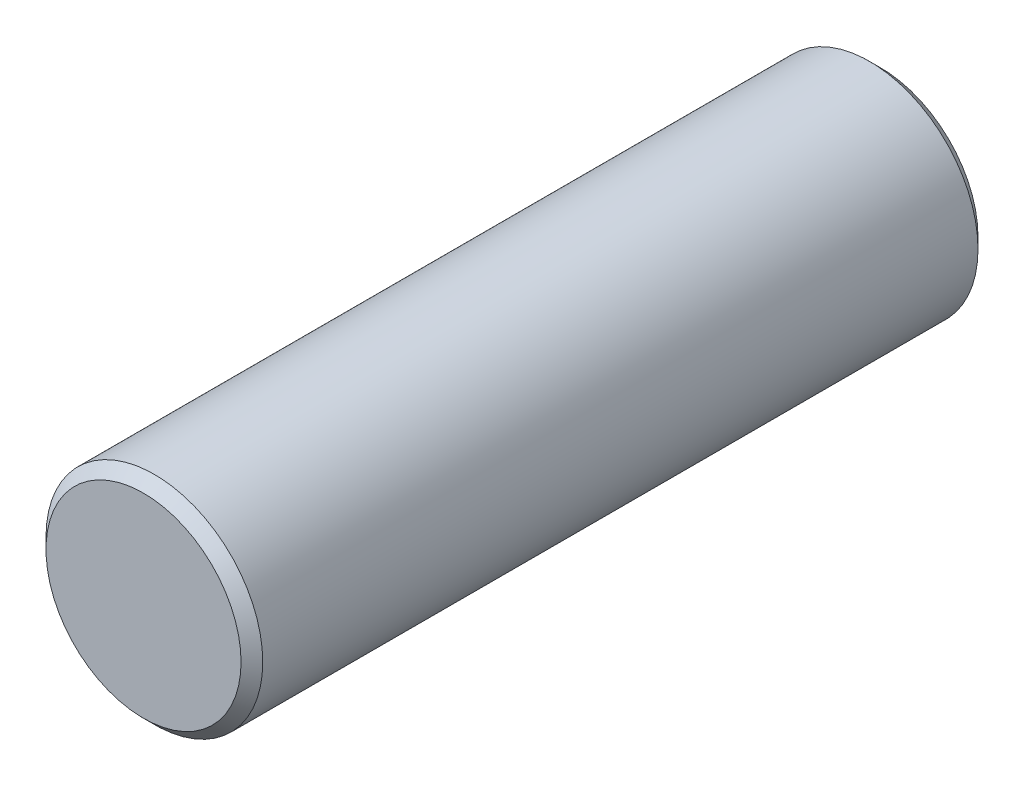
ISO-10303-21;
HEADER;
FILE_DESCRIPTION(('STEP AP214'),'2;1');
FILE_NAME('part.step','',(''),(''),'','','');
FILE_SCHEMA(('AUTOMOTIVE_DESIGN { 1 0 10303 214 1 1 1 1 }'));
ENDSEC;
DATA;
#1=APPLICATION_CONTEXT('core data for automotive mechanical design processes');
#2=APPLICATION_PROTOCOL_DEFINITION('international standard','automotive_design',2000,#1);
#3=PRODUCT_CONTEXT('',#1,'mechanical');
#4=PRODUCT('Part','Part','',(#3));
#5=PRODUCT_RELATED_PRODUCT_CATEGORY('part','',(#4));
#6=PRODUCT_DEFINITION_FORMATION('','',#4);
#7=PRODUCT_DEFINITION_CONTEXT('part definition',#1,'design');
#8=PRODUCT_DEFINITION('design','',#6,#7);
#9=PRODUCT_DEFINITION_SHAPE('','',#8);
#10=(LENGTH_UNIT() NAMED_UNIT(*) SI_UNIT(.MILLI.,.METRE.));
#11=(NAMED_UNIT(*) PLANE_ANGLE_UNIT() SI_UNIT($,.RADIAN.));
#12=(NAMED_UNIT(*) SI_UNIT($,.STERADIAN.) SOLID_ANGLE_UNIT());
#13=UNCERTAINTY_MEASURE_WITH_UNIT(LENGTH_MEASURE(1.E-05),#10,'distance_accuracy_value','');
#14=(GEOMETRIC_REPRESENTATION_CONTEXT(3) GLOBAL_UNCERTAINTY_ASSIGNED_CONTEXT((#13)) GLOBAL_UNIT_ASSIGNED_CONTEXT((#10,
#11,#12)) REPRESENTATION_CONTEXT('',''));
#15=CARTESIAN_POINT('',(0.,0.,0.));
#16=DIRECTION('',(0.,0.,1.));
#17=DIRECTION('',(1.,0.,0.));
#18=AXIS2_PLACEMENT_3D('',#15,#16,#17);
#19=CARTESIAN_POINT('',(0.,0.,17.));
#20=DIRECTION('',(0.,0.,-1.));
#21=DIRECTION('',(-1.,0.,0.));
#22=AXIS2_PLACEMENT_3D('',#19,#20,#21);
#23=CYLINDRICAL_SURFACE('',#22,5.);
#24=CARTESIAN_POINT('',(0.,0.,-16.5));
#25=DIRECTION('',(0.,0.,1.));
#26=DIRECTION('',(1.,0.,0.));
#27=AXIS2_PLACEMENT_3D('',#24,#25,#26);
#28=CIRCLE('',#27,5.);
#29=CARTESIAN_POINT('',(5.,0.,-16.5));
#30=VERTEX_POINT('',#29);
#31=EDGE_CURVE('E50',#30,#30,#28,.T.);
#32=ORIENTED_EDGE('',*,*,#31,.T.);
#33=EDGE_LOOP('',(#32));
#34=FACE_BOUND('',#33,.T.);
#35=CARTESIAN_POINT('',(0.,0.,16.5));
#36=DIRECTION('',(0.,0.,1.));
#37=DIRECTION('',(1.,0.,0.));
#38=AXIS2_PLACEMENT_3D('',#35,#36,#37);
#39=CIRCLE('',#38,5.);
#40=CARTESIAN_POINT('',(5.,0.,16.5));
#41=VERTEX_POINT('',#40);
#42=EDGE_CURVE('E54',#41,#41,#39,.F.);
#43=ORIENTED_EDGE('',*,*,#42,.T.);
#44=EDGE_LOOP('',(#43));
#45=FACE_BOUND('',#44,.T.);
#46=ADVANCED_FACE('F38',(#34,#45),#23,.T.);
#47=CARTESIAN_POINT('',(0.,0.,17.));
#48=DIRECTION('',(0.,0.,1.));
#49=DIRECTION('',(1.,0.,0.));
#50=AXIS2_PLACEMENT_3D('',#47,#48,#49);
#51=PLANE('',#50);
#52=CARTESIAN_POINT('',(0.,0.,17.));
#53=DIRECTION('',(0.,0.,1.));
#54=DIRECTION('',(1.,0.,0.));
#55=AXIS2_PLACEMENT_3D('',#52,#53,#54);
#56=CIRCLE('',#55,4.5);
#57=CARTESIAN_POINT('',(4.5,0.,17.));
#58=VERTEX_POINT('',#57);
#59=EDGE_CURVE('E10',#58,#58,#56,.T.);
#60=ORIENTED_EDGE('',*,*,#59,.T.);
#61=EDGE_LOOP('',(#60));
#62=FACE_BOUND('',#61,.T.);
#63=ADVANCED_FACE('F70',(#62),#51,.T.);
#64=CARTESIAN_POINT('',(0.,0.,-17.));
#65=DIRECTION('',(0.,0.,1.));
#66=DIRECTION('',(1.,0.,0.));
#67=AXIS2_PLACEMENT_3D('',#64,#65,#66);
#68=PLANE('',#67);
#69=CARTESIAN_POINT('',(0.,0.,-17.));
#70=DIRECTION('',(0.,0.,1.));
#71=DIRECTION('',(1.,0.,0.));
#72=AXIS2_PLACEMENT_3D('',#69,#70,#71);
#73=CIRCLE('',#72,4.5);
#74=CARTESIAN_POINT('',(4.5,0.,-17.));
#75=VERTEX_POINT('',#74);
#76=EDGE_CURVE('E46',#75,#75,#73,.F.);
#77=ORIENTED_EDGE('',*,*,#76,.T.);
#78=EDGE_LOOP('',(#77));
#79=FACE_BOUND('',#78,.T.);
#80=ADVANCED_FACE('F67',(#79),#68,.F.);
#81=CARTESIAN_POINT('',(0.,0.,-16.5));
#82=DIRECTION('',(0.,0.,1.));
#83=DIRECTION('',(1.,0.,0.));
#84=AXIS2_PLACEMENT_3D('',#81,#82,#83);
#85=CONICAL_SURFACE('',#84,5.,0.785398163397457);
#86=ORIENTED_EDGE('',*,*,#76,.F.);
#87=EDGE_LOOP('',(#86));
#88=FACE_BOUND('',#87,.T.);
#89=ORIENTED_EDGE('',*,*,#31,.F.);
#90=EDGE_LOOP('',(#89));
#91=FACE_BOUND('',#90,.T.);
#92=ADVANCED_FACE('F63',(#88,#91),#85,.T.);
#93=CARTESIAN_POINT('',(0.,0.,17.));
#94=DIRECTION('',(0.,0.,-1.));
#95=DIRECTION('',(-1.,0.,0.));
#96=AXIS2_PLACEMENT_3D('',#93,#94,#95);
#97=CONICAL_SURFACE('',#96,4.5,0.78539816339745);
#98=ORIENTED_EDGE('',*,*,#42,.F.);
#99=EDGE_LOOP('',(#98));
#100=FACE_BOUND('',#99,.T.);
#101=ORIENTED_EDGE('',*,*,#59,.F.);
#102=EDGE_LOOP('',(#101));
#103=FACE_BOUND('',#102,.T.);
#104=ADVANCED_FACE('F41',(#100,#103),#97,.T.);
#105=CLOSED_SHELL('',(#46,#63,#80,#92,#104));
#106=MANIFOLD_SOLID_BREP('B2',#105);
#107=ADVANCED_BREP_SHAPE_REPRESENTATION('',(#18,#106),#14);
#108=SHAPE_DEFINITION_REPRESENTATION(#9,#107);
ENDSEC;
END-ISO-10303-21;
